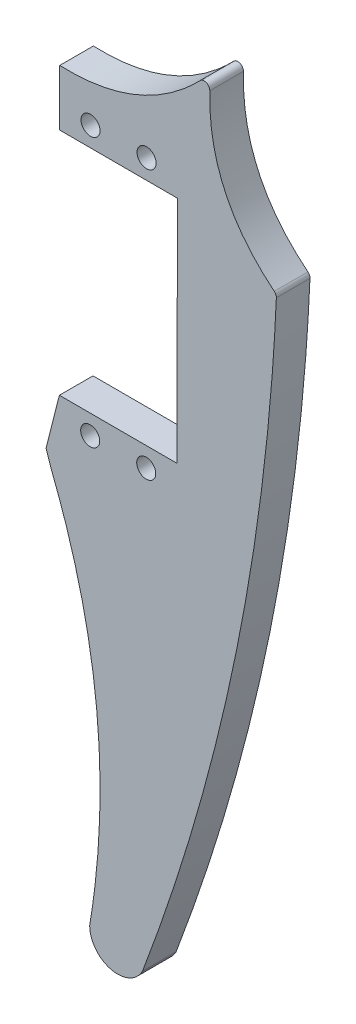
ISO-10303-21;
HEADER;
FILE_DESCRIPTION(('STEP AP214'),'2;1');
FILE_NAME('part.step','',(''),(''),'','','');
FILE_SCHEMA(('AUTOMOTIVE_DESIGN { 1 0 10303 214 1 1 1 1 }'));
ENDSEC;
DATA;
#1=APPLICATION_CONTEXT('core data for automotive mechanical design processes');
#2=APPLICATION_PROTOCOL_DEFINITION('international standard','automotive_design',2000,#1);
#3=PRODUCT_CONTEXT('',#1,'mechanical');
#4=PRODUCT('Part','Part','',(#3));
#5=PRODUCT_RELATED_PRODUCT_CATEGORY('part','',(#4));
#6=PRODUCT_DEFINITION_FORMATION('','',#4);
#7=PRODUCT_DEFINITION_CONTEXT('part definition',#1,'design');
#8=PRODUCT_DEFINITION('design','',#6,#7);
#9=PRODUCT_DEFINITION_SHAPE('','',#8);
#10=(LENGTH_UNIT() NAMED_UNIT(*) SI_UNIT(.MILLI.,.METRE.));
#11=(NAMED_UNIT(*) PLANE_ANGLE_UNIT() SI_UNIT($,.RADIAN.));
#12=(NAMED_UNIT(*) SI_UNIT($,.STERADIAN.) SOLID_ANGLE_UNIT());
#13=UNCERTAINTY_MEASURE_WITH_UNIT(LENGTH_MEASURE(1.E-05),#10,'distance_accuracy_value','');
#14=(GEOMETRIC_REPRESENTATION_CONTEXT(3) GLOBAL_UNCERTAINTY_ASSIGNED_CONTEXT((#13)) GLOBAL_UNIT_ASSIGNED_CONTEXT((#10,
#11,#12)) REPRESENTATION_CONTEXT('',''));
#15=CARTESIAN_POINT('',(0.,0.,0.));
#16=DIRECTION('',(0.,0.,1.));
#17=DIRECTION('',(1.,0.,0.));
#18=AXIS2_PLACEMENT_3D('',#15,#16,#17);
#19=CARTESIAN_POINT('',(0.,0.,0.));
#20=DIRECTION('',(0.,0.,-1.));
#21=DIRECTION('',(-1.,0.,0.));
#22=AXIS2_PLACEMENT_3D('',#19,#20,#21);
#23=PLANE('',#22);
#24=CARTESIAN_POINT('',(-2.66559293881463,55.9422382398678,0.));
#25=DIRECTION('',(0.,0.,1.));
#26=DIRECTION('',(1.,0.,0.));
#27=AXIS2_PLACEMENT_3D('',#24,#25,#26);
#28=CIRCLE('',#27,1.7);
#29=CARTESIAN_POINT('',(-0.965592938814632,55.9422382398678,0.));
#30=VERTEX_POINT('',#29);
#31=EDGE_CURVE('E244',#30,#30,#28,.T.);
#32=ORIENTED_EDGE('',*,*,#31,.T.);
#33=EDGE_LOOP('',(#32));
#34=FACE_BOUND('',#33,.T.);
#35=CARTESIAN_POINT('',(-12.6655855251962,55.9544149517882,0.));
#36=DIRECTION('',(0.,0.,1.));
#37=DIRECTION('',(1.,0.,0.));
#38=AXIS2_PLACEMENT_3D('',#35,#36,#37);
#39=CIRCLE('',#38,1.7);
#40=CARTESIAN_POINT('',(-10.9655855251962,55.9544149517882,0.));
#41=VERTEX_POINT('',#40);
#42=EDGE_CURVE('E248',#41,#41,#39,.T.);
#43=ORIENTED_EDGE('',*,*,#42,.T.);
#44=EDGE_LOOP('',(#43));
#45=FACE_BOUND('',#44,.T.);
#46=CARTESIAN_POINT('',(-2.72404115603306,7.94227382523614,0.));
#47=DIRECTION('',(0.,0.,1.));
#48=DIRECTION('',(1.,0.,0.));
#49=AXIS2_PLACEMENT_3D('',#46,#47,#48);
#50=CIRCLE('',#49,1.7);
#51=CARTESIAN_POINT('',(-1.02404115603306,7.94227382523614,0.));
#52=VERTEX_POINT('',#51);
#53=EDGE_CURVE('E252',#52,#52,#50,.T.);
#54=ORIENTED_EDGE('',*,*,#53,.T.);
#55=EDGE_LOOP('',(#54));
#56=FACE_BOUND('',#55,.T.);
#57=CARTESIAN_POINT('',(-12.7240337424147,7.95445053715654,0.));
#58=DIRECTION('',(0.,0.,1.));
#59=DIRECTION('',(1.,0.,0.));
#60=AXIS2_PLACEMENT_3D('',#57,#58,#59);
#61=CIRCLE('',#60,1.7);
#62=CARTESIAN_POINT('',(-11.0240337424147,7.95445053715654,0.));
#63=VERTEX_POINT('',#62);
#64=EDGE_CURVE('E255',#63,#63,#61,.T.);
#65=ORIENTED_EDGE('',*,*,#64,.T.);
#66=EDGE_LOOP('',(#65));
#67=FACE_BOUND('',#66,.T.);
#68=DIRECTION('',(0.999999258638159,-0.00121767119204022,0.));
#69=VECTOR('',#68,1.);
#70=CARTESIAN_POINT('',(0.0638533999134726,52.4389120744586,0.));
#71=LINE('',#70,#69);
#72=CARTESIAN_POINT('',(-18.1698432968782,52.4611147381109,0.));
#73=VERTEX_POINT('',#72);
#74=CARTESIAN_POINT('',(2.8301411345231,52.435543643078,0.));
#75=VERTEX_POINT('',#74);
#76=EDGE_CURVE('E192',#73,#75,#71,.T.);
#77=ORIENTED_EDGE('',*,*,#76,.F.);
#78=DIRECTION('',(-0.00121767119204003,-0.999999258638159,0.));
#79=VECTOR('',#78,1.);
#80=CARTESIAN_POINT('',(-18.2336966967917,0.0222026636522862,0.));
#81=LINE('',#80,#79);
#82=CARTESIAN_POINT('',(-18.1576665849578,62.4611073244924,0.));
#83=VERTEX_POINT('',#82);
#84=EDGE_CURVE('E186',#83,#73,#81,.T.);
#85=ORIENTED_EDGE('',*,*,#84,.F.);
#86=CARTESIAN_POINT('',(-18.1576665849578,62.4611073244924,0.));
#87=CARTESIAN_POINT('',(-16.5957874277075,62.4005452503153,0.));
#88=CARTESIAN_POINT('',(-13.7727592012234,62.4642612584156,0.));
#89=CARTESIAN_POINT('',(-9.69759227790533,63.0745821355176,0.));
#90=CARTESIAN_POINT('',(-6.32351089958761,64.0141760149711,0.));
#91=CARTESIAN_POINT('',(-3.33075761597419,65.2191562551885,0.));
#92=CARTESIAN_POINT('',(-0.944811530450129,66.4543218460898,0.));
#93=CARTESIAN_POINT('',(1.1131199033705,67.7452294218354,0.));
#94=CARTESIAN_POINT('',(3.76103033511005,69.6585184882513,0.));
#95=CARTESIAN_POINT('',(5.63181454416512,71.3460793665513,0.));
#96=CARTESIAN_POINT('',(6.9002953510042,72.6534021775221,0.));
#97=B_SPLINE_CURVE_WITH_KNOTS('',3,(#86,#87,#88,#89,#90,#91,#92,#93,#94,#95,#96),.UNSPECIFIED.,
.F.,.F.,(4,1,1,1,1,1,1,1,4),(0.,0.167942372431457,0.302841242438336,0.441808798814354,
0.543310726360135,0.649111051598296,0.730099181004828,0.804199887465434,1.),.UNSPECIFIED.);
#98=CARTESIAN_POINT('',(6.9002953510042,72.6534021775221,0.));
#99=VERTEX_POINT('',#98);
#100=EDGE_CURVE('E194',#83,#99,#97,.T.);
#101=ORIENTED_EDGE('',*,*,#100,.T.);
#102=CARTESIAN_POINT('',(7.61788384822747,71.9569348425717,0.));
#103=DIRECTION('',(0.,0.,1.));
#104=DIRECTION('',(1.,0.,0.));
#105=AXIS2_PLACEMENT_3D('',#102,#103,#104);
#106=CIRCLE('',#105,1.00000000000002);
#107=CARTESIAN_POINT('',(8.61752230313877,71.9300469370642,0.));
#108=VERTEX_POINT('',#107);
#109=EDGE_CURVE('E119',#99,#108,#106,.F.);
#110=ORIENTED_EDGE('',*,*,#109,.T.);
#111=CARTESIAN_POINT('',(8.61752230313878,71.9300469370642,0.));
#112=CARTESIAN_POINT('',(8.59071032442277,70.9315873327442,0.));
#113=CARTESIAN_POINT('',(8.61624793452768,68.5087262249472,0.));
#114=CARTESIAN_POINT('',(8.97509158991618,65.3341630010076,0.));
#115=CARTESIAN_POINT('',(9.6753555930249,62.1669174163871,0.));
#116=CARTESIAN_POINT('',(10.4078261619931,59.8784619924768,0.));
#117=CARTESIAN_POINT('',(11.3756378025867,57.5670825642234,0.));
#118=CARTESIAN_POINT('',(12.4767056948452,55.4208887808106,0.));
#119=CARTESIAN_POINT('',(13.9857346576301,53.0737608445887,0.));
#120=CARTESIAN_POINT('',(15.6990910048526,50.9092476903399,0.));
#121=CARTESIAN_POINT('',(17.7271002556335,48.7577944539025,0.));
#122=CARTESIAN_POINT('',(19.2236084889232,47.4296027033118,0.));
#123=CARTESIAN_POINT('',(20.123317243586,46.7017928554225,0.));
#124=B_SPLINE_CURVE_WITH_KNOTS('',3,(#111,#112,#113,#114,#115,#116,#117,#118,#119,#120,#121,
#122,#123),.UNSPECIFIED.,.F.,.F.,(4,1,1,1,1,1,1,1,1,1,4),(0.,0.104003479977303,
0.252210123737354,0.331596334915173,0.441573043683324,0.501852928285922,0.592428261132943,
0.692389888172366,0.791956145638254,0.879471991361137,1.),.UNSPECIFIED.);
#125=CARTESIAN_POINT('',(20.123317243586,46.7017928554225,0.));
#126=VERTEX_POINT('',#125);
#127=EDGE_CURVE('E353',#108,#126,#124,.T.);
#128=ORIENTED_EDGE('',*,*,#127,.T.);
#129=CARTESIAN_POINT('',(19.4943791424345,45.9243374773332,0.));
#130=DIRECTION('',(0.,0.,1.));
#131=DIRECTION('',(1.,0.,0.));
#132=AXIS2_PLACEMENT_3D('',#129,#130,#131);
#133=CIRCLE('',#132,1.00000000000001);
#134=CARTESIAN_POINT('',(20.4934181887921,45.8805084475371,0.));
#135=VERTEX_POINT('',#134);
#136=EDGE_CURVE('E355',#126,#135,#133,.F.);
#137=ORIENTED_EDGE('',*,*,#136,.T.);
#138=CARTESIAN_POINT('',(-3.38612977093725,-70.1197283377999,0.));
#139=CARTESIAN_POINT('',(-2.21747594034385,-67.0294558969488,0.));
#140=CARTESIAN_POINT('',(-0.182430907587835,-61.43213239004,0.));
#141=CARTESIAN_POINT('',(2.32063883935794,-54.0108691689048,0.));
#142=CARTESIAN_POINT('',(4.3961259301075,-47.4719588064395,0.));
#143=CARTESIAN_POINT('',(6.08423338920354,-41.8267543964302,0.));
#144=CARTESIAN_POINT('',(7.77337133405126,-35.8279238652745,0.));
#145=CARTESIAN_POINT('',(9.31448555291117,-30.0062852988135,0.));
#146=CARTESIAN_POINT('',(10.8471776534988,-23.7773500875834,0.));
#147=CARTESIAN_POINT('',(12.2485313089098,-17.6339956332685,0.));
#148=CARTESIAN_POINT('',(13.3818409896019,-12.2462437225145,0.));
#149=CARTESIAN_POINT('',(14.4459234087207,-6.81321548756019,0.));
#150=CARTESIAN_POINT('',(15.4509486459676,-1.27346626759468,0.));
#151=CARTESIAN_POINT('',(16.5413239357779,5.39780281073926,0.));
#152=CARTESIAN_POINT('',(17.5257968178992,12.2274526169646,0.));
#153=CARTESIAN_POINT('',(18.3182927356866,18.5775262450371,0.));
#154=CARTESIAN_POINT('',(18.9682433171335,24.5560057386506,0.));
#155=CARTESIAN_POINT('',(19.5468192208513,30.7473577426984,0.));
#156=CARTESIAN_POINT('',(20.0911443120764,37.9796568208143,0.));
#157=CARTESIAN_POINT('',(20.3737749236158,43.1533278077299,0.));
#158=CARTESIAN_POINT('',(20.4934181887921,45.8805084475371,0.));
#159=B_SPLINE_CURVE_WITH_KNOTS('',3,(#138,#139,#140,#141,#142,#143,#144,#145,#146,#147,#148,
#149,#150,#151,#152,#153,#154,#155,#156,#157,#158),.UNSPECIFIED.,.F.,.F.,(4,1,1,1,1,1,1,1,1,1,1,
1,1,1,1,1,1,1,4),(0.,0.0833350972674383,0.150214343327616,0.197536109488555,0.256374008818779,
0.298827669062736,0.35472864721647,0.408266596763316,0.460622920884634,0.513659664150615,
0.547132194446658,0.600265326939374,0.655665944108754,0.717630207138085,0.774302923350448,
0.817071636404434,0.869313559792076,0.931144900431086,1.),.UNSPECIFIED.);
#160=CARTESIAN_POINT('',(-3.38612977093726,-70.1197283377999,0.));
#161=VERTEX_POINT('',#160);
#162=EDGE_CURVE('E356',#161,#135,#159,.T.);
#163=ORIENTED_EDGE('',*,*,#162,.F.);
#164=CARTESIAN_POINT('',(-7.81627604202041,-67.8015816606442,0.));
#165=DIRECTION('',(0.,0.,1.));
#166=DIRECTION('',(1.,0.,0.));
#167=AXIS2_PLACEMENT_3D('',#164,#165,#166);
#168=CIRCLE('',#167,5.);
#169=CARTESIAN_POINT('',(-12.8162723352112,-67.795493304684,0.));
#170=VERTEX_POINT('',#169);
#171=EDGE_CURVE('E381',#170,#161,#168,.T.);
#172=ORIENTED_EDGE('',*,*,#171,.F.);
#173=CARTESIAN_POINT('',(-20.602879388512,2.09524486769532,0.));
#174=CARTESIAN_POINT('',(-20.0205238959627,0.117608733950737,0.));
#175=CARTESIAN_POINT('',(-18.5974914524959,-3.33433158845714,0.));
#176=CARTESIAN_POINT('',(-16.9041811842998,-8.26319836443814,0.));
#177=CARTESIAN_POINT('',(-15.5956651518347,-12.5461317451937,0.));
#178=CARTESIAN_POINT('',(-14.4561327292944,-16.8104083443648,0.));
#179=CARTESIAN_POINT('',(-13.5029800154141,-20.9757070837244,0.));
#180=CARTESIAN_POINT('',(-12.4750787269643,-26.3755770774982,0.));
#181=CARTESIAN_POINT('',(-11.5930469927093,-32.6604101156868,0.));
#182=CARTESIAN_POINT('',(-10.8025123362547,-42.889860588898,0.));
#183=CARTESIAN_POINT('',(-11.0087567135261,-54.6420651792428,0.));
#184=CARTESIAN_POINT('',(-12.1531044470753,-63.8384276037237,0.));
#185=CARTESIAN_POINT('',(-12.8162723352112,-67.795493304684,0.));
#186=B_SPLINE_CURVE_WITH_KNOTS('',3,(#173,#174,#175,#176,#177,#178,#179,#180,#181,#182,#183,
#184,#185),.UNSPECIFIED.,.F.,.F.,(4,1,1,1,1,1,1,1,1,1,4),(0.,0.0866462036411952,
0.157135059350928,0.219373112735095,0.27519462868181,0.342966261602374,0.399251522742452,
0.506628071870763,0.609997757522428,0.831095498086737,1.),.UNSPECIFIED.);
#187=CARTESIAN_POINT('',(-20.6028793885121,2.09524486769532,0.));
#188=VERTEX_POINT('',#187);
#189=EDGE_CURVE('E386',#188,#170,#186,.T.);
#190=ORIENTED_EDGE('',*,*,#189,.F.);
#191=DIRECTION('',(-0.246588344586289,-0.969120316737914,0.));
#192=VECTOR('',#191,1.);
#193=CARTESIAN_POINT('',(-19.8508131589928,5.05095092015446,0.));
#194=LINE('',#193,#192);
#195=CARTESIAN_POINT('',(-18.2197678157519,11.4611451339463,0.));
#196=VERTEX_POINT('',#195);
#197=EDGE_CURVE('E391',#196,#188,#194,.T.);
#198=ORIENTED_EDGE('',*,*,#197,.F.);
#199=DIRECTION('',(-0.999999258638159,0.00121767119204022,0.));
#200=VECTOR('',#199,1.);
#201=CARTESIAN_POINT('',(0.0139288810398234,11.438942470294,0.));
#202=LINE('',#201,#200);
#203=CARTESIAN_POINT('',(2.78021661564946,11.4355740389135,0.));
#204=VERTEX_POINT('',#203);
#205=EDGE_CURVE('E543',#204,#196,#202,.T.);
#206=ORIENTED_EDGE('',*,*,#205,.F.);
#207=DIRECTION('',(-0.00121767119204013,-0.999999258638159,0.));
#208=VECTOR('',#207,1.);
#209=CARTESIAN_POINT('',(2.76628773460963,-0.00336843138055459,0.));
#210=LINE('',#209,#208);
#211=EDGE_CURVE('E545',#75,#204,#210,.T.);
#212=ORIENTED_EDGE('',*,*,#211,.F.);
#213=EDGE_LOOP('',(#77,#85,#101,#110,#128,#137,#163,#172,#190,#198,#206,#212));
#214=FACE_BOUND('',#213,.T.);
#215=ADVANCED_FACE('F96',(#34,#45,#56,#67,#214),#23,.T.);
#216=CARTESIAN_POINT('',(-18.2336966967917,0.0222026636522862,0.));
#217=DIRECTION('',(-0.999999258638159,0.00121767119204003,0.));
#218=DIRECTION('',(-0.00121767119204003,-0.999999258638159,0.));
#219=AXIS2_PLACEMENT_3D('',#216,#217,#218);
#220=PLANE('',#219);
#221=DIRECTION('',(-0.00121767119204003,-0.999999258638159,0.));
#222=VECTOR('',#221,1.);
#223=CARTESIAN_POINT('',(-18.2336966967917,0.0222026636522862,6.));
#224=LINE('',#223,#222);
#225=CARTESIAN_POINT('',(-18.1576665849578,62.4611073244924,6.));
#226=VERTEX_POINT('',#225);
#227=CARTESIAN_POINT('',(-18.1698432968782,52.4611147381109,6.));
#228=VERTEX_POINT('',#227);
#229=EDGE_CURVE('E111',#226,#228,#224,.T.);
#230=ORIENTED_EDGE('',*,*,#229,.F.);
#231=DIRECTION('',(0.,0.,1.));
#232=VECTOR('',#231,1.);
#233=CARTESIAN_POINT('',(-18.1576665849578,62.4611073244924,0.));
#234=LINE('',#233,#232);
#235=EDGE_CURVE('E99',#83,#226,#234,.T.);
#236=ORIENTED_EDGE('',*,*,#235,.F.);
#237=ORIENTED_EDGE('',*,*,#84,.T.);
#238=DIRECTION('',(0.,0.,1.));
#239=VECTOR('',#238,1.);
#240=CARTESIAN_POINT('',(-18.1698432968782,52.4611147381109,0.));
#241=LINE('',#240,#239);
#242=EDGE_CURVE('E12',#73,#228,#241,.T.);
#243=ORIENTED_EDGE('',*,*,#242,.T.);
#244=EDGE_LOOP('',(#230,#236,#237,#243));
#245=FACE_BOUND('',#244,.T.);
#246=ADVANCED_FACE('F184',(#245),#220,.T.);
#247=CARTESIAN_POINT('',(0.0638533999134726,52.4389120744586,0.));
#248=DIRECTION('',(-0.00121767119204022,-0.999999258638159,0.));
#249=DIRECTION('',(0.999999258638159,-0.00121767119204022,0.));
#250=AXIS2_PLACEMENT_3D('',#247,#248,#249);
#251=PLANE('',#250);
#252=DIRECTION('',(0.999999258638159,-0.00121767119204022,0.));
#253=VECTOR('',#252,1.);
#254=CARTESIAN_POINT('',(0.0638533999134726,52.4389120744586,6.));
#255=LINE('',#254,#253);
#256=CARTESIAN_POINT('',(2.8301411345231,52.435543643078,6.));
#257=VERTEX_POINT('',#256);
#258=EDGE_CURVE('E200',#228,#257,#255,.T.);
#259=ORIENTED_EDGE('',*,*,#258,.F.);
#260=ORIENTED_EDGE('',*,*,#242,.F.);
#261=ORIENTED_EDGE('',*,*,#76,.T.);
#262=DIRECTION('',(0.,0.,1.));
#263=VECTOR('',#262,1.);
#264=CARTESIAN_POINT('',(2.8301411345231,52.435543643078,0.));
#265=LINE('',#264,#263);
#266=EDGE_CURVE('E104',#75,#257,#265,.T.);
#267=ORIENTED_EDGE('',*,*,#266,.T.);
#268=EDGE_LOOP('',(#259,#260,#261,#267));
#269=FACE_BOUND('',#268,.T.);
#270=ADVANCED_FACE('F224',(#269),#251,.T.);
#271=CARTESIAN_POINT('',(2.76628773460963,-0.00336843138055459,0.));
#272=DIRECTION('',(-0.999999258638159,0.00121767119204013,0.));
#273=DIRECTION('',(-0.00121767119204013,-0.999999258638159,0.));
#274=AXIS2_PLACEMENT_3D('',#271,#272,#273);
#275=PLANE('',#274);
#276=DIRECTION('',(-0.00121767119204013,-0.999999258638159,0.));
#277=VECTOR('',#276,1.);
#278=CARTESIAN_POINT('',(2.76628773460963,-0.00336843138055459,6.));
#279=LINE('',#278,#277);
#280=CARTESIAN_POINT('',(2.78021661564946,11.4355740389135,6.));
#281=VERTEX_POINT('',#280);
#282=EDGE_CURVE('E203',#257,#281,#279,.T.);
#283=ORIENTED_EDGE('',*,*,#282,.F.);
#284=ORIENTED_EDGE('',*,*,#266,.F.);
#285=ORIENTED_EDGE('',*,*,#211,.T.);
#286=DIRECTION('',(0.,0.,1.));
#287=VECTOR('',#286,1.);
#288=CARTESIAN_POINT('',(2.78021661564946,11.4355740389135,0.));
#289=LINE('',#288,#287);
#290=EDGE_CURVE('E332',#204,#281,#289,.T.);
#291=ORIENTED_EDGE('',*,*,#290,.T.);
#292=EDGE_LOOP('',(#283,#284,#285,#291));
#293=FACE_BOUND('',#292,.T.);
#294=ADVANCED_FACE('F407',(#293),#275,.T.);
#295=CARTESIAN_POINT('',(0.0139288810398234,11.438942470294,0.));
#296=DIRECTION('',(0.00121767119204022,0.999999258638159,0.));
#297=DIRECTION('',(-0.999999258638159,0.00121767119204022,0.));
#298=AXIS2_PLACEMENT_3D('',#295,#296,#297);
#299=PLANE('',#298);
#300=DIRECTION('',(-0.999999258638159,0.00121767119204022,0.));
#301=VECTOR('',#300,1.);
#302=CARTESIAN_POINT('',(0.0139288810398234,11.438942470294,6.));
#303=LINE('',#302,#301);
#304=CARTESIAN_POINT('',(-18.2197678157519,11.4611451339463,6.));
#305=VERTEX_POINT('',#304);
#306=EDGE_CURVE('E327',#281,#305,#303,.T.);
#307=ORIENTED_EDGE('',*,*,#306,.F.);
#308=ORIENTED_EDGE('',*,*,#290,.F.);
#309=ORIENTED_EDGE('',*,*,#205,.T.);
#310=DIRECTION('',(0.,0.,1.));
#311=VECTOR('',#310,1.);
#312=CARTESIAN_POINT('',(-18.2197678157519,11.4611451339463,0.));
#313=LINE('',#312,#311);
#314=EDGE_CURVE('E334',#196,#305,#313,.T.);
#315=ORIENTED_EDGE('',*,*,#314,.T.);
#316=EDGE_LOOP('',(#307,#308,#309,#315));
#317=FACE_BOUND('',#316,.T.);
#318=ADVANCED_FACE('F403',(#317),#299,.T.);
#319=CARTESIAN_POINT('',(-19.8508131589928,5.05095092015446,0.));
#320=DIRECTION('',(-0.969120316737914,0.246588344586289,0.));
#321=DIRECTION('',(-0.246588344586289,-0.969120316737914,0.));
#322=AXIS2_PLACEMENT_3D('',#319,#320,#321);
#323=PLANE('',#322);
#324=DIRECTION('',(-0.246588344586289,-0.969120316737914,0.));
#325=VECTOR('',#324,1.);
#326=CARTESIAN_POINT('',(-19.8508131589928,5.05095092015446,6.));
#327=LINE('',#326,#325);
#328=CARTESIAN_POINT('',(-20.6028793885121,2.09524486769532,6.));
#329=VERTEX_POINT('',#328);
#330=EDGE_CURVE('E321',#305,#329,#327,.T.);
#331=ORIENTED_EDGE('',*,*,#330,.F.);
#332=ORIENTED_EDGE('',*,*,#314,.F.);
#333=ORIENTED_EDGE('',*,*,#197,.T.);
#334=DIRECTION('',(0.,0.,1.));
#335=VECTOR('',#334,1.);
#336=CARTESIAN_POINT('',(-20.6028793885121,2.09524486769532,0.));
#337=LINE('',#336,#335);
#338=EDGE_CURVE('E336',#188,#329,#337,.T.);
#339=ORIENTED_EDGE('',*,*,#338,.T.);
#340=EDGE_LOOP('',(#331,#332,#333,#339));
#341=FACE_BOUND('',#340,.T.);
#342=ADVANCED_FACE('F399',(#341),#323,.T.);
#343=DIRECTION('',(0.,0.,1.));
#344=VECTOR('',#343,1.);
#345=SURFACE_OF_LINEAR_EXTRUSION('',#186,#344);
#346=CARTESIAN_POINT('',(-20.602879388512,2.09524486769532,6.));
#347=CARTESIAN_POINT('',(-20.0205238959627,0.117608733950737,6.));
#348=CARTESIAN_POINT('',(-18.5974914524959,-3.33433158845714,6.));
#349=CARTESIAN_POINT('',(-16.9041811842998,-8.26319836443814,6.));
#350=CARTESIAN_POINT('',(-15.5956651518347,-12.5461317451937,6.));
#351=CARTESIAN_POINT('',(-14.4561327292944,-16.8104083443648,6.));
#352=CARTESIAN_POINT('',(-13.5029800154141,-20.9757070837244,6.));
#353=CARTESIAN_POINT('',(-12.4750787269643,-26.3755770774982,6.));
#354=CARTESIAN_POINT('',(-11.5930469927093,-32.6604101156868,6.));
#355=CARTESIAN_POINT('',(-10.8025123362547,-42.889860588898,6.));
#356=CARTESIAN_POINT('',(-11.0087567135261,-54.6420651792428,6.));
#357=CARTESIAN_POINT('',(-12.1531044470753,-63.8384276037237,6.));
#358=CARTESIAN_POINT('',(-12.8162723352112,-67.795493304684,6.));
#359=B_SPLINE_CURVE_WITH_KNOTS('',3,(#346,#347,#348,#349,#350,#351,#352,#353,#354,#355,#356,
#357,#358),.UNSPECIFIED.,.F.,.F.,(4,1,1,1,1,1,1,1,1,1,4),(0.,0.0866462036411952,
0.157135059350928,0.219373112735095,0.27519462868181,0.342966261602374,0.399251522742452,
0.506628071870763,0.609997757522428,0.831095498086737,1.),.UNSPECIFIED.);
#360=CARTESIAN_POINT('',(-12.8162723352112,-67.795493304684,6.));
#361=VERTEX_POINT('',#360);
#362=EDGE_CURVE('E316',#329,#361,#359,.T.);
#363=ORIENTED_EDGE('',*,*,#362,.F.);
#364=ORIENTED_EDGE('',*,*,#338,.F.);
#365=ORIENTED_EDGE('',*,*,#189,.T.);
#366=DIRECTION('',(0.,0.,1.));
#367=VECTOR('',#366,1.);
#368=CARTESIAN_POINT('',(-12.8162723352112,-67.795493304684,0.));
#369=LINE('',#368,#367);
#370=EDGE_CURVE('E338',#170,#361,#369,.T.);
#371=ORIENTED_EDGE('',*,*,#370,.T.);
#372=EDGE_LOOP('',(#363,#364,#365,#371));
#373=FACE_BOUND('',#372,.T.);
#374=ADVANCED_FACE('F396',(#373),#345,.T.);
#375=CARTESIAN_POINT('',(-7.81627604202041,-67.8015816606442,0.));
#376=DIRECTION('',(0.,0.,1.));
#377=DIRECTION('',(1.,0.,0.));
#378=AXIS2_PLACEMENT_3D('',#375,#376,#377);
#379=CYLINDRICAL_SURFACE('',#378,5.);
#380=CARTESIAN_POINT('',(-7.81627604202041,-67.8015816606442,6.));
#381=DIRECTION('',(0.,0.,1.));
#382=DIRECTION('',(1.,0.,0.));
#383=AXIS2_PLACEMENT_3D('',#380,#381,#382);
#384=CIRCLE('',#383,5.);
#385=CARTESIAN_POINT('',(-3.38612977093726,-70.1197283377999,6.));
#386=VERTEX_POINT('',#385);
#387=EDGE_CURVE('E310',#361,#386,#384,.T.);
#388=ORIENTED_EDGE('',*,*,#387,.F.);
#389=ORIENTED_EDGE('',*,*,#370,.F.);
#390=ORIENTED_EDGE('',*,*,#171,.T.);
#391=DIRECTION('',(0.,0.,1.));
#392=VECTOR('',#391,1.);
#393=CARTESIAN_POINT('',(-3.38612977093726,-70.1197283377999,0.));
#394=LINE('',#393,#392);
#395=EDGE_CURVE('E340',#161,#386,#394,.T.);
#396=ORIENTED_EDGE('',*,*,#395,.T.);
#397=EDGE_LOOP('',(#388,#389,#390,#396));
#398=FACE_BOUND('',#397,.T.);
#399=ADVANCED_FACE('F374',(#398),#379,.T.);
#400=DIRECTION('',(0.,0.,1.));
#401=VECTOR('',#400,1.);
#402=SURFACE_OF_LINEAR_EXTRUSION('',#159,#401);
#403=CARTESIAN_POINT('',(-3.38612977093725,-70.1197283377999,6.));
#404=CARTESIAN_POINT('',(-2.21747594034385,-67.0294558969488,6.));
#405=CARTESIAN_POINT('',(-0.182430907587835,-61.43213239004,6.));
#406=CARTESIAN_POINT('',(2.32063883935794,-54.0108691689048,6.));
#407=CARTESIAN_POINT('',(4.3961259301075,-47.4719588064395,6.));
#408=CARTESIAN_POINT('',(6.08423338920354,-41.8267543964302,6.));
#409=CARTESIAN_POINT('',(7.77337133405126,-35.8279238652745,6.));
#410=CARTESIAN_POINT('',(9.31448555291117,-30.0062852988135,6.));
#411=CARTESIAN_POINT('',(10.8471776534988,-23.7773500875834,6.));
#412=CARTESIAN_POINT('',(12.2485313089098,-17.6339956332685,6.));
#413=CARTESIAN_POINT('',(13.3818409896019,-12.2462437225145,6.));
#414=CARTESIAN_POINT('',(14.4459234087207,-6.81321548756019,6.));
#415=CARTESIAN_POINT('',(15.4509486459676,-1.27346626759468,6.));
#416=CARTESIAN_POINT('',(16.5413239357779,5.39780281073926,6.));
#417=CARTESIAN_POINT('',(17.5257968178992,12.2274526169646,6.));
#418=CARTESIAN_POINT('',(18.3182927356866,18.5775262450371,6.));
#419=CARTESIAN_POINT('',(18.9682433171335,24.5560057386506,6.));
#420=CARTESIAN_POINT('',(19.5468192208513,30.7473577426984,6.));
#421=CARTESIAN_POINT('',(20.0911443120764,37.9796568208143,6.));
#422=CARTESIAN_POINT('',(20.3737749236158,43.1533278077299,6.));
#423=CARTESIAN_POINT('',(20.4934181887921,45.8805084475371,6.));
#424=B_SPLINE_CURVE_WITH_KNOTS('',3,(#403,#404,#405,#406,#407,#408,#409,#410,#411,#412,#413,
#414,#415,#416,#417,#418,#419,#420,#421,#422,#423),.UNSPECIFIED.,.F.,.F.,(4,1,1,1,1,1,1,1,1,1,1,
1,1,1,1,1,1,1,4),(0.,0.0833350972674383,0.150214343327616,0.197536109488555,0.256374008818779,
0.298827669062736,0.35472864721647,0.408266596763316,0.460622920884634,0.513659664150615,
0.547132194446658,0.600265326939374,0.655665944108754,0.717630207138085,0.774302923350448,
0.817071636404434,0.869313559792076,0.931144900431086,1.),.UNSPECIFIED.);
#425=CARTESIAN_POINT('',(20.4934181887921,45.8805084475371,6.));
#426=VERTEX_POINT('',#425);
#427=EDGE_CURVE('E305',#386,#426,#424,.T.);
#428=ORIENTED_EDGE('',*,*,#427,.F.);
#429=ORIENTED_EDGE('',*,*,#395,.F.);
#430=ORIENTED_EDGE('',*,*,#162,.T.);
#431=DIRECTION('',(0.,0.,1.));
#432=VECTOR('',#431,1.);
#433=CARTESIAN_POINT('',(20.4934181887921,45.8805084475371,0.));
#434=LINE('',#433,#432);
#435=EDGE_CURVE('E342',#135,#426,#434,.T.);
#436=ORIENTED_EDGE('',*,*,#435,.T.);
#437=EDGE_LOOP('',(#428,#429,#430,#436));
#438=FACE_BOUND('',#437,.T.);
#439=ADVANCED_FACE('F370',(#438),#402,.T.);
#440=CARTESIAN_POINT('',(19.4943791424345,45.9243374773332,0.));
#441=DIRECTION('',(0.,0.,1.));
#442=DIRECTION('',(1.,0.,0.));
#443=AXIS2_PLACEMENT_3D('',#440,#441,#442);
#444=CYLINDRICAL_SURFACE('',#443,1.00000000000001);
#445=CARTESIAN_POINT('',(19.4943791424345,45.9243374773332,6.));
#446=DIRECTION('',(0.,0.,1.));
#447=DIRECTION('',(1.,0.,0.));
#448=AXIS2_PLACEMENT_3D('',#445,#446,#447);
#449=CIRCLE('',#448,1.00000000000001);
#450=CARTESIAN_POINT('',(20.123317243586,46.7017928554225,6.));
#451=VERTEX_POINT('',#450);
#452=EDGE_CURVE('E299',#451,#426,#449,.F.);
#453=ORIENTED_EDGE('',*,*,#452,.T.);
#454=ORIENTED_EDGE('',*,*,#435,.F.);
#455=ORIENTED_EDGE('',*,*,#136,.F.);
#456=DIRECTION('',(0.,0.,1.));
#457=VECTOR('',#456,1.);
#458=CARTESIAN_POINT('',(20.123317243586,46.7017928554225,0.));
#459=LINE('',#458,#457);
#460=EDGE_CURVE('E344',#126,#451,#459,.T.);
#461=ORIENTED_EDGE('',*,*,#460,.T.);
#462=EDGE_LOOP('',(#453,#454,#455,#461));
#463=FACE_BOUND('',#462,.T.);
#464=ADVANCED_FACE('F367',(#463),#444,.T.);
#465=DIRECTION('',(0.,0.,1.));
#466=VECTOR('',#465,1.);
#467=SURFACE_OF_LINEAR_EXTRUSION('',#124,#466);
#468=CARTESIAN_POINT('',(8.61752230313878,71.9300469370642,6.));
#469=CARTESIAN_POINT('',(8.59071032442277,70.9315873327442,6.));
#470=CARTESIAN_POINT('',(8.61624793452768,68.5087262249472,6.));
#471=CARTESIAN_POINT('',(8.97509158991618,65.3341630010076,6.));
#472=CARTESIAN_POINT('',(9.6753555930249,62.1669174163871,6.));
#473=CARTESIAN_POINT('',(10.4078261619931,59.8784619924768,6.));
#474=CARTESIAN_POINT('',(11.3756378025867,57.5670825642234,6.));
#475=CARTESIAN_POINT('',(12.4767056948452,55.4208887808106,6.));
#476=CARTESIAN_POINT('',(13.9857346576301,53.0737608445887,6.));
#477=CARTESIAN_POINT('',(15.6990910048526,50.9092476903399,6.));
#478=CARTESIAN_POINT('',(17.7271002556335,48.7577944539025,6.));
#479=CARTESIAN_POINT('',(19.2236084889232,47.4296027033118,6.));
#480=CARTESIAN_POINT('',(20.123317243586,46.7017928554225,6.));
#481=B_SPLINE_CURVE_WITH_KNOTS('',3,(#468,#469,#470,#471,#472,#473,#474,#475,#476,#477,#478,
#479,#480),.UNSPECIFIED.,.F.,.F.,(4,1,1,1,1,1,1,1,1,1,4),(0.,0.104003479977303,
0.252210123737354,0.331596334915173,0.441573043683324,0.501852928285922,0.592428261132943,
0.692389888172366,0.791956145638254,0.879471991361137,1.),.UNSPECIFIED.);
#482=CARTESIAN_POINT('',(8.61752230313877,71.9300469370642,6.));
#483=VERTEX_POINT('',#482);
#484=EDGE_CURVE('E286',#483,#451,#481,.T.);
#485=ORIENTED_EDGE('',*,*,#484,.T.);
#486=ORIENTED_EDGE('',*,*,#460,.F.);
#487=ORIENTED_EDGE('',*,*,#127,.F.);
#488=DIRECTION('',(0.,0.,1.));
#489=VECTOR('',#488,1.);
#490=CARTESIAN_POINT('',(8.61752230313877,71.9300469370642,0.));
#491=LINE('',#490,#489);
#492=EDGE_CURVE('E346',#108,#483,#491,.T.);
#493=ORIENTED_EDGE('',*,*,#492,.T.);
#494=EDGE_LOOP('',(#485,#486,#487,#493));
#495=FACE_BOUND('',#494,.T.);
#496=ADVANCED_FACE('F350',(#495),#467,.F.);
#497=CARTESIAN_POINT('',(7.61788384822747,71.9569348425717,0.));
#498=DIRECTION('',(0.,0.,1.));
#499=DIRECTION('',(1.,0.,0.));
#500=AXIS2_PLACEMENT_3D('',#497,#498,#499);
#501=CYLINDRICAL_SURFACE('',#500,1.00000000000002);
#502=CARTESIAN_POINT('',(7.61788384822747,71.9569348425717,6.));
#503=DIRECTION('',(0.,0.,1.));
#504=DIRECTION('',(1.,0.,0.));
#505=AXIS2_PLACEMENT_3D('',#502,#503,#504);
#506=CIRCLE('',#505,1.00000000000002);
#507=CARTESIAN_POINT('',(6.9002953510042,72.6534021775221,6.));
#508=VERTEX_POINT('',#507);
#509=EDGE_CURVE('E284',#508,#483,#506,.F.);
#510=ORIENTED_EDGE('',*,*,#509,.T.);
#511=ORIENTED_EDGE('',*,*,#492,.F.);
#512=ORIENTED_EDGE('',*,*,#109,.F.);
#513=DIRECTION('',(0.,0.,1.));
#514=VECTOR('',#513,1.);
#515=CARTESIAN_POINT('',(6.9002953510042,72.6534021775221,0.));
#516=LINE('',#515,#514);
#517=EDGE_CURVE('E191',#99,#508,#516,.T.);
#518=ORIENTED_EDGE('',*,*,#517,.T.);
#519=EDGE_LOOP('',(#510,#511,#512,#518));
#520=FACE_BOUND('',#519,.T.);
#521=ADVANCED_FACE('F221',(#520),#501,.T.);
#522=DIRECTION('',(0.,0.,1.));
#523=VECTOR('',#522,1.);
#524=SURFACE_OF_LINEAR_EXTRUSION('',#97,#523);
#525=CARTESIAN_POINT('',(-18.1576665849578,62.4611073244924,6.));
#526=CARTESIAN_POINT('',(-16.5957874277075,62.4005452503153,6.));
#527=CARTESIAN_POINT('',(-13.7727592012234,62.4642612584156,6.));
#528=CARTESIAN_POINT('',(-9.69759227790533,63.0745821355176,6.));
#529=CARTESIAN_POINT('',(-6.32351089958761,64.0141760149711,6.));
#530=CARTESIAN_POINT('',(-3.33075761597419,65.2191562551885,6.));
#531=CARTESIAN_POINT('',(-0.944811530450129,66.4543218460898,6.));
#532=CARTESIAN_POINT('',(1.1131199033705,67.7452294218354,6.));
#533=CARTESIAN_POINT('',(3.76103033511005,69.6585184882513,6.));
#534=CARTESIAN_POINT('',(5.63181454416512,71.3460793665513,6.));
#535=CARTESIAN_POINT('',(6.9002953510042,72.6534021775221,6.));
#536=B_SPLINE_CURVE_WITH_KNOTS('',3,(#525,#526,#527,#528,#529,#530,#531,#532,#533,#534,#535),
.UNSPECIFIED.,.F.,.F.,(4,1,1,1,1,1,1,1,4),(0.,0.167942372431457,0.302841242438336,
0.441808798814354,0.543310726360135,0.649111051598296,0.730099181004828,0.804199887465434,1.),.UNSPECIFIED.);
#537=EDGE_CURVE('E259',#226,#508,#536,.T.);
#538=ORIENTED_EDGE('',*,*,#537,.T.);
#539=ORIENTED_EDGE('',*,*,#517,.F.);
#540=ORIENTED_EDGE('',*,*,#100,.F.);
#541=ORIENTED_EDGE('',*,*,#235,.T.);
#542=EDGE_LOOP('',(#538,#539,#540,#541));
#543=FACE_BOUND('',#542,.T.);
#544=ADVANCED_FACE('F195',(#543),#524,.F.);
#545=CARTESIAN_POINT('',(-12.7240337424147,7.95445053715654,0.));
#546=DIRECTION('',(0.,0.,1.));
#547=DIRECTION('',(1.,0.,0.));
#548=AXIS2_PLACEMENT_3D('',#545,#546,#547);
#549=CYLINDRICAL_SURFACE('',#548,1.7);
#550=ORIENTED_EDGE('',*,*,#64,.F.);
#551=EDGE_LOOP('',(#550));
#552=FACE_BOUND('',#551,.T.);
#553=CARTESIAN_POINT('',(-12.7240337424147,7.95445053715654,6.));
#554=DIRECTION('',(0.,0.,1.));
#555=DIRECTION('',(1.,0.,0.));
#556=AXIS2_PLACEMENT_3D('',#553,#554,#555);
#557=CIRCLE('',#556,1.7);
#558=CARTESIAN_POINT('',(-11.0240337424147,7.95445053715654,6.));
#559=VERTEX_POINT('',#558);
#560=EDGE_CURVE('E257',#559,#559,#557,.T.);
#561=ORIENTED_EDGE('',*,*,#560,.T.);
#562=EDGE_LOOP('',(#561));
#563=FACE_BOUND('',#562,.T.);
#564=ADVANCED_FACE('F220',(#552,#563),#549,.F.);
#565=CARTESIAN_POINT('',(-2.72404115603306,7.94227382523614,0.));
#566=DIRECTION('',(0.,0.,1.));
#567=DIRECTION('',(1.,0.,0.));
#568=AXIS2_PLACEMENT_3D('',#565,#566,#567);
#569=CYLINDRICAL_SURFACE('',#568,1.7);
#570=ORIENTED_EDGE('',*,*,#53,.F.);
#571=EDGE_LOOP('',(#570));
#572=FACE_BOUND('',#571,.T.);
#573=CARTESIAN_POINT('',(-2.72404115603306,7.94227382523614,6.));
#574=DIRECTION('',(0.,0.,1.));
#575=DIRECTION('',(1.,0.,0.));
#576=AXIS2_PLACEMENT_3D('',#573,#574,#575);
#577=CIRCLE('',#576,1.7);
#578=CARTESIAN_POINT('',(-1.02404115603306,7.94227382523614,6.));
#579=VERTEX_POINT('',#578);
#580=EDGE_CURVE('E265',#579,#579,#577,.T.);
#581=ORIENTED_EDGE('',*,*,#580,.T.);
#582=EDGE_LOOP('',(#581));
#583=FACE_BOUND('',#582,.T.);
#584=ADVANCED_FACE('F417',(#572,#583),#569,.F.);
#585=CARTESIAN_POINT('',(-12.6655855251962,55.9544149517882,0.));
#586=DIRECTION('',(0.,0.,1.));
#587=DIRECTION('',(1.,0.,0.));
#588=AXIS2_PLACEMENT_3D('',#585,#586,#587);
#589=CYLINDRICAL_SURFACE('',#588,1.7);
#590=ORIENTED_EDGE('',*,*,#42,.F.);
#591=EDGE_LOOP('',(#590));
#592=FACE_BOUND('',#591,.T.);
#593=CARTESIAN_POINT('',(-12.6655855251962,55.9544149517882,6.));
#594=DIRECTION('',(0.,0.,1.));
#595=DIRECTION('',(1.,0.,0.));
#596=AXIS2_PLACEMENT_3D('',#593,#594,#595);
#597=CIRCLE('',#596,1.7);
#598=CARTESIAN_POINT('',(-10.9655855251962,55.9544149517882,6.));
#599=VERTEX_POINT('',#598);
#600=EDGE_CURVE('E269',#599,#599,#597,.T.);
#601=ORIENTED_EDGE('',*,*,#600,.T.);
#602=EDGE_LOOP('',(#601));
#603=FACE_BOUND('',#602,.T.);
#604=ADVANCED_FACE('F232',(#592,#603),#589,.F.);
#605=CARTESIAN_POINT('',(-2.66559293881463,55.9422382398678,0.));
#606=DIRECTION('',(0.,0.,1.));
#607=DIRECTION('',(1.,0.,0.));
#608=AXIS2_PLACEMENT_3D('',#605,#606,#607);
#609=CYLINDRICAL_SURFACE('',#608,1.7);
#610=ORIENTED_EDGE('',*,*,#31,.F.);
#611=EDGE_LOOP('',(#610));
#612=FACE_BOUND('',#611,.T.);
#613=CARTESIAN_POINT('',(-2.66559293881463,55.9422382398678,6.));
#614=DIRECTION('',(0.,0.,1.));
#615=DIRECTION('',(1.,0.,0.));
#616=AXIS2_PLACEMENT_3D('',#613,#614,#615);
#617=CIRCLE('',#616,1.7);
#618=CARTESIAN_POINT('',(-0.965592938814632,55.9422382398678,6.));
#619=VERTEX_POINT('',#618);
#620=EDGE_CURVE('E206',#619,#619,#617,.T.);
#621=ORIENTED_EDGE('',*,*,#620,.T.);
#622=EDGE_LOOP('',(#621));
#623=FACE_BOUND('',#622,.T.);
#624=ADVANCED_FACE('F227',(#612,#623),#609,.F.);
#625=CARTESIAN_POINT('',(0.,0.,6.));
#626=DIRECTION('',(0.,0.,-1.));
#627=DIRECTION('',(-1.,0.,0.));
#628=AXIS2_PLACEMENT_3D('',#625,#626,#627);
#629=PLANE('',#628);
#630=ORIENTED_EDGE('',*,*,#620,.F.);
#631=EDGE_LOOP('',(#630));
#632=FACE_BOUND('',#631,.T.);
#633=ORIENTED_EDGE('',*,*,#600,.F.);
#634=EDGE_LOOP('',(#633));
#635=FACE_BOUND('',#634,.T.);
#636=ORIENTED_EDGE('',*,*,#580,.F.);
#637=EDGE_LOOP('',(#636));
#638=FACE_BOUND('',#637,.T.);
#639=ORIENTED_EDGE('',*,*,#560,.F.);
#640=EDGE_LOOP('',(#639));
#641=FACE_BOUND('',#640,.T.);
#642=ORIENTED_EDGE('',*,*,#229,.T.);
#643=ORIENTED_EDGE('',*,*,#258,.T.);
#644=ORIENTED_EDGE('',*,*,#282,.T.);
#645=ORIENTED_EDGE('',*,*,#306,.T.);
#646=ORIENTED_EDGE('',*,*,#330,.T.);
#647=ORIENTED_EDGE('',*,*,#362,.T.);
#648=ORIENTED_EDGE('',*,*,#387,.T.);
#649=ORIENTED_EDGE('',*,*,#427,.T.);
#650=ORIENTED_EDGE('',*,*,#452,.F.);
#651=ORIENTED_EDGE('',*,*,#484,.F.);
#652=ORIENTED_EDGE('',*,*,#509,.F.);
#653=ORIENTED_EDGE('',*,*,#537,.F.);
#654=EDGE_LOOP('',(#642,#643,#644,#645,#646,#647,#648,#649,#650,#651,#652,#653));
#655=FACE_BOUND('',#654,.T.);
#656=ADVANCED_FACE('F225',(#632,#635,#638,#641,#655),#629,.F.);
#657=CLOSED_SHELL('',(#215,#246,#270,#294,#318,#342,#374,#399,#439,#464,#496,#521,#544,#564,
#584,#604,#624,#656));
#658=MANIFOLD_SOLID_BREP('B2',#657);
#659=ADVANCED_BREP_SHAPE_REPRESENTATION('',(#18,#658),#14);
#660=SHAPE_DEFINITION_REPRESENTATION(#9,#659);
ENDSEC;
END-ISO-10303-21;
